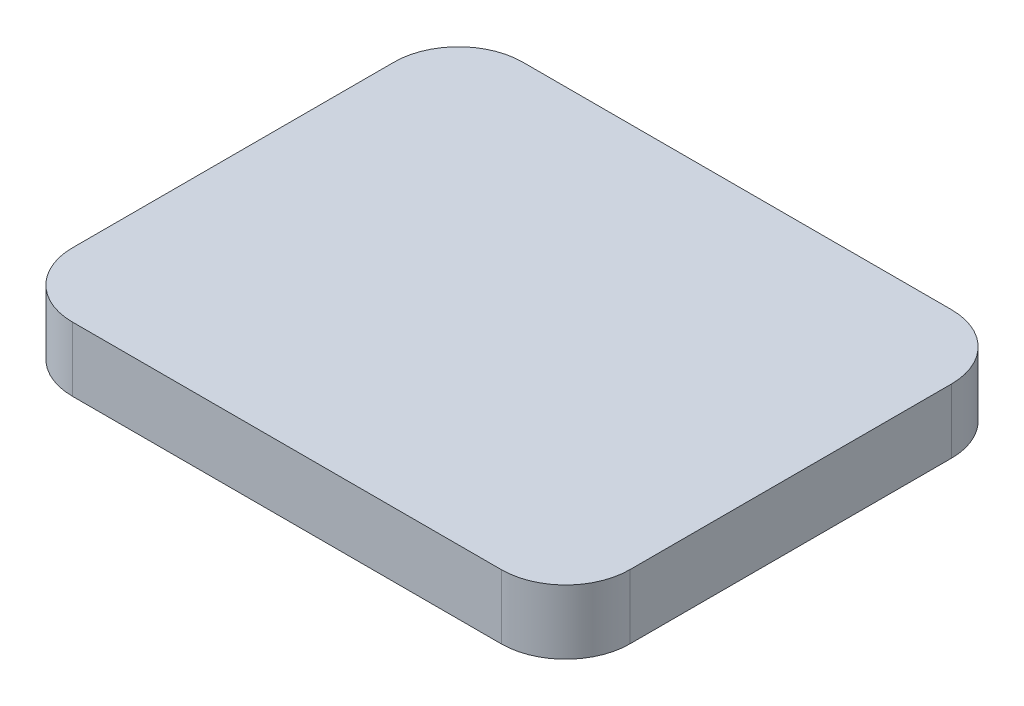
ISO-10303-21;
HEADER;
FILE_DESCRIPTION(('STEP AP214'),'2;1');
FILE_NAME('part.step','',(''),(''),'','','');
FILE_SCHEMA(('AUTOMOTIVE_DESIGN { 1 0 10303 214 1 1 1 1 }'));
ENDSEC;
DATA;
#1=APPLICATION_CONTEXT('core data for automotive mechanical design processes');
#2=APPLICATION_PROTOCOL_DEFINITION('international standard','automotive_design',2000,#1);
#3=PRODUCT_CONTEXT('',#1,'mechanical');
#4=PRODUCT('Part','Part','',(#3));
#5=PRODUCT_RELATED_PRODUCT_CATEGORY('part','',(#4));
#6=PRODUCT_DEFINITION_FORMATION('','',#4);
#7=PRODUCT_DEFINITION_CONTEXT('part definition',#1,'design');
#8=PRODUCT_DEFINITION('design','',#6,#7);
#9=PRODUCT_DEFINITION_SHAPE('','',#8);
#10=(LENGTH_UNIT() NAMED_UNIT(*) SI_UNIT(.MILLI.,.METRE.));
#11=(NAMED_UNIT(*) PLANE_ANGLE_UNIT() SI_UNIT($,.RADIAN.));
#12=(NAMED_UNIT(*) SI_UNIT($,.STERADIAN.) SOLID_ANGLE_UNIT());
#13=UNCERTAINTY_MEASURE_WITH_UNIT(LENGTH_MEASURE(1.E-05),#10,'distance_accuracy_value','');
#14=(GEOMETRIC_REPRESENTATION_CONTEXT(3) GLOBAL_UNCERTAINTY_ASSIGNED_CONTEXT((#13)) GLOBAL_UNIT_ASSIGNED_CONTEXT((#10,
#11,#12)) REPRESENTATION_CONTEXT('',''));
#15=CARTESIAN_POINT('',(0.,0.,0.));
#16=DIRECTION('',(0.,0.,1.));
#17=DIRECTION('',(1.,0.,0.));
#18=AXIS2_PLACEMENT_3D('',#15,#16,#17);
#19=CARTESIAN_POINT('',(100.,30.,-75.));
#20=DIRECTION('',(0.,-1.,0.));
#21=DIRECTION('',(0.,0.,-1.));
#22=AXIS2_PLACEMENT_3D('',#19,#20,#21);
#23=CYLINDRICAL_SURFACE('',#22,30.);
#24=CARTESIAN_POINT('',(100.,0.,-75.));
#25=DIRECTION('',(0.,1.,0.));
#26=DIRECTION('',(0.,0.,-1.));
#27=AXIS2_PLACEMENT_3D('',#24,#25,#26);
#28=CIRCLE('',#27,30.);
#29=CARTESIAN_POINT('',(130.,0.,-75.));
#30=VERTEX_POINT('',#29);
#31=CARTESIAN_POINT('',(100.,0.,-105.));
#32=VERTEX_POINT('',#31);
#33=EDGE_CURVE('E140',#30,#32,#28,.T.);
#34=ORIENTED_EDGE('',*,*,#33,.T.);
#35=DIRECTION('',(0.,-1.,0.));
#36=VECTOR('',#35,1.);
#37=CARTESIAN_POINT('',(100.,30.,-105.));
#38=LINE('',#37,#36);
#39=CARTESIAN_POINT('',(100.,30.,-105.));
#40=VERTEX_POINT('',#39);
#41=EDGE_CURVE('E11',#40,#32,#38,.T.);
#42=ORIENTED_EDGE('',*,*,#41,.F.);
#43=CARTESIAN_POINT('',(100.,30.,-75.));
#44=DIRECTION('',(0.,1.,0.));
#45=DIRECTION('',(0.,0.,-1.));
#46=AXIS2_PLACEMENT_3D('',#43,#44,#45);
#47=CIRCLE('',#46,30.);
#48=CARTESIAN_POINT('',(130.,30.,-75.));
#49=VERTEX_POINT('',#48);
#50=EDGE_CURVE('E162',#49,#40,#47,.T.);
#51=ORIENTED_EDGE('',*,*,#50,.F.);
#52=DIRECTION('',(0.,-1.,0.));
#53=VECTOR('',#52,1.);
#54=CARTESIAN_POINT('',(130.,30.,-75.));
#55=LINE('',#54,#53);
#56=EDGE_CURVE('E136',#49,#30,#55,.T.);
#57=ORIENTED_EDGE('',*,*,#56,.T.);
#58=EDGE_LOOP('',(#34,#42,#51,#57));
#59=FACE_BOUND('',#58,.T.);
#60=ADVANCED_FACE('F39',(#59),#23,.T.);
#61=CARTESIAN_POINT('',(-100.,30.,-105.));
#62=DIRECTION('',(0.,0.,1.));
#63=DIRECTION('',(1.,0.,0.));
#64=AXIS2_PLACEMENT_3D('',#61,#62,#63);
#65=PLANE('',#64);
#66=DIRECTION('',(-1.,0.,0.));
#67=VECTOR('',#66,1.);
#68=CARTESIAN_POINT('',(-100.,0.,-105.));
#69=LINE('',#68,#67);
#70=CARTESIAN_POINT('',(-100.,0.,-105.));
#71=VERTEX_POINT('',#70);
#72=EDGE_CURVE('E144',#32,#71,#69,.T.);
#73=ORIENTED_EDGE('',*,*,#72,.T.);
#74=DIRECTION('',(0.,-1.,0.));
#75=VECTOR('',#74,1.);
#76=CARTESIAN_POINT('',(-100.,30.,-105.));
#77=LINE('',#76,#75);
#78=CARTESIAN_POINT('',(-100.,30.,-105.));
#79=VERTEX_POINT('',#78);
#80=EDGE_CURVE('E48',#79,#71,#77,.T.);
#81=ORIENTED_EDGE('',*,*,#80,.F.);
#82=DIRECTION('',(-1.,0.,0.));
#83=VECTOR('',#82,1.);
#84=CARTESIAN_POINT('',(-100.,30.,-105.));
#85=LINE('',#84,#83);
#86=EDGE_CURVE('E99',#40,#79,#85,.T.);
#87=ORIENTED_EDGE('',*,*,#86,.F.);
#88=ORIENTED_EDGE('',*,*,#41,.T.);
#89=EDGE_LOOP('',(#73,#81,#87,#88));
#90=FACE_BOUND('',#89,.T.);
#91=ADVANCED_FACE('F208',(#90),#65,.F.);
#92=CARTESIAN_POINT('',(-100.,30.,-75.));
#93=DIRECTION('',(0.,-1.,0.));
#94=DIRECTION('',(0.,0.,-1.));
#95=AXIS2_PLACEMENT_3D('',#92,#93,#94);
#96=CYLINDRICAL_SURFACE('',#95,30.);
#97=CARTESIAN_POINT('',(-100.,0.,-75.));
#98=DIRECTION('',(0.,1.,0.));
#99=DIRECTION('',(0.,0.,1.));
#100=AXIS2_PLACEMENT_3D('',#97,#98,#99);
#101=CIRCLE('',#100,30.);
#102=CARTESIAN_POINT('',(-130.,0.,-75.));
#103=VERTEX_POINT('',#102);
#104=EDGE_CURVE('E147',#71,#103,#101,.T.);
#105=ORIENTED_EDGE('',*,*,#104,.T.);
#106=DIRECTION('',(0.,-1.,0.));
#107=VECTOR('',#106,1.);
#108=CARTESIAN_POINT('',(-130.,30.,-75.));
#109=LINE('',#108,#107);
#110=CARTESIAN_POINT('',(-130.,30.,-75.));
#111=VERTEX_POINT('',#110);
#112=EDGE_CURVE('E173',#111,#103,#109,.T.);
#113=ORIENTED_EDGE('',*,*,#112,.F.);
#114=CARTESIAN_POINT('',(-100.,30.,-75.));
#115=DIRECTION('',(0.,1.,0.));
#116=DIRECTION('',(0.,0.,1.));
#117=AXIS2_PLACEMENT_3D('',#114,#115,#116);
#118=CIRCLE('',#117,30.);
#119=EDGE_CURVE('E183',#79,#111,#118,.T.);
#120=ORIENTED_EDGE('',*,*,#119,.F.);
#121=ORIENTED_EDGE('',*,*,#80,.T.);
#122=EDGE_LOOP('',(#105,#113,#120,#121));
#123=FACE_BOUND('',#122,.T.);
#124=ADVANCED_FACE('F181',(#123),#96,.T.);
#125=CARTESIAN_POINT('',(-130.,30.,-75.));
#126=DIRECTION('',(1.,0.,0.));
#127=DIRECTION('',(0.,0.,-1.));
#128=AXIS2_PLACEMENT_3D('',#125,#126,#127);
#129=PLANE('',#128);
#130=DIRECTION('',(0.,0.,1.));
#131=VECTOR('',#130,1.);
#132=CARTESIAN_POINT('',(-130.,0.,-75.));
#133=LINE('',#132,#131);
#134=CARTESIAN_POINT('',(-130.,0.,75.));
#135=VERTEX_POINT('',#134);
#136=EDGE_CURVE('E150',#103,#135,#133,.T.);
#137=ORIENTED_EDGE('',*,*,#136,.T.);
#138=DIRECTION('',(0.,-1.,0.));
#139=VECTOR('',#138,1.);
#140=CARTESIAN_POINT('',(-130.,30.,75.));
#141=LINE('',#140,#139);
#142=CARTESIAN_POINT('',(-130.,30.,75.));
#143=VERTEX_POINT('',#142);
#144=EDGE_CURVE('E169',#143,#135,#141,.T.);
#145=ORIENTED_EDGE('',*,*,#144,.F.);
#146=DIRECTION('',(0.,0.,1.));
#147=VECTOR('',#146,1.);
#148=CARTESIAN_POINT('',(-130.,30.,-75.));
#149=LINE('',#148,#147);
#150=EDGE_CURVE('E196',#111,#143,#149,.T.);
#151=ORIENTED_EDGE('',*,*,#150,.F.);
#152=ORIENTED_EDGE('',*,*,#112,.T.);
#153=EDGE_LOOP('',(#137,#145,#151,#152));
#154=FACE_BOUND('',#153,.T.);
#155=ADVANCED_FACE('F191',(#154),#129,.F.);
#156=CARTESIAN_POINT('',(-100.,30.,75.));
#157=DIRECTION('',(0.,-1.,0.));
#158=DIRECTION('',(0.,0.,-1.));
#159=AXIS2_PLACEMENT_3D('',#156,#157,#158);
#160=CYLINDRICAL_SURFACE('',#159,29.9999999999999);
#161=CARTESIAN_POINT('',(-100.,0.,75.));
#162=DIRECTION('',(0.,1.,0.));
#163=DIRECTION('',(0.,0.,1.));
#164=AXIS2_PLACEMENT_3D('',#161,#162,#163);
#165=CIRCLE('',#164,29.9999999999999);
#166=CARTESIAN_POINT('',(-100.,0.,105.));
#167=VERTEX_POINT('',#166);
#168=EDGE_CURVE('E153',#135,#167,#165,.T.);
#169=ORIENTED_EDGE('',*,*,#168,.T.);
#170=DIRECTION('',(0.,-1.,0.));
#171=VECTOR('',#170,1.);
#172=CARTESIAN_POINT('',(-100.,30.,105.));
#173=LINE('',#172,#171);
#174=CARTESIAN_POINT('',(-100.,30.,105.));
#175=VERTEX_POINT('',#174);
#176=EDGE_CURVE('E129',#175,#167,#173,.T.);
#177=ORIENTED_EDGE('',*,*,#176,.F.);
#178=CARTESIAN_POINT('',(-100.,30.,75.));
#179=DIRECTION('',(0.,1.,0.));
#180=DIRECTION('',(0.,0.,1.));
#181=AXIS2_PLACEMENT_3D('',#178,#179,#180);
#182=CIRCLE('',#181,29.9999999999999);
#183=EDGE_CURVE('E118',#143,#175,#182,.T.);
#184=ORIENTED_EDGE('',*,*,#183,.F.);
#185=ORIENTED_EDGE('',*,*,#144,.T.);
#186=EDGE_LOOP('',(#169,#177,#184,#185));
#187=FACE_BOUND('',#186,.T.);
#188=ADVANCED_FACE('F194',(#187),#160,.T.);
#189=CARTESIAN_POINT('',(-100.,30.,105.));
#190=DIRECTION('',(0.,0.,-1.));
#191=DIRECTION('',(-1.,0.,0.));
#192=AXIS2_PLACEMENT_3D('',#189,#190,#191);
#193=PLANE('',#192);
#194=DIRECTION('',(1.,0.,0.));
#195=VECTOR('',#194,1.);
#196=CARTESIAN_POINT('',(-100.,0.,105.));
#197=LINE('',#196,#195);
#198=CARTESIAN_POINT('',(100.,0.,105.));
#199=VERTEX_POINT('',#198);
#200=EDGE_CURVE('E127',#167,#199,#197,.T.);
#201=ORIENTED_EDGE('',*,*,#200,.T.);
#202=DIRECTION('',(0.,-1.,0.));
#203=VECTOR('',#202,1.);
#204=CARTESIAN_POINT('',(100.,30.,105.));
#205=LINE('',#204,#203);
#206=CARTESIAN_POINT('',(100.,30.,105.));
#207=VERTEX_POINT('',#206);
#208=EDGE_CURVE('E124',#207,#199,#205,.T.);
#209=ORIENTED_EDGE('',*,*,#208,.F.);
#210=DIRECTION('',(1.,0.,0.));
#211=VECTOR('',#210,1.);
#212=CARTESIAN_POINT('',(-100.,30.,105.));
#213=LINE('',#212,#211);
#214=EDGE_CURVE('E112',#175,#207,#213,.T.);
#215=ORIENTED_EDGE('',*,*,#214,.F.);
#216=ORIENTED_EDGE('',*,*,#176,.T.);
#217=EDGE_LOOP('',(#201,#209,#215,#216));
#218=FACE_BOUND('',#217,.T.);
#219=ADVANCED_FACE('F125',(#218),#193,.F.);
#220=CARTESIAN_POINT('',(100.,30.,75.));
#221=DIRECTION('',(0.,-1.,0.));
#222=DIRECTION('',(0.,0.,-1.));
#223=AXIS2_PLACEMENT_3D('',#220,#221,#222);
#224=CYLINDRICAL_SURFACE('',#223,30.);
#225=CARTESIAN_POINT('',(100.,0.,75.));
#226=DIRECTION('',(0.,1.,0.));
#227=DIRECTION('',(0.,0.,1.));
#228=AXIS2_PLACEMENT_3D('',#225,#226,#227);
#229=CIRCLE('',#228,30.);
#230=CARTESIAN_POINT('',(130.,0.,75.));
#231=VERTEX_POINT('',#230);
#232=EDGE_CURVE('E85',#199,#231,#229,.T.);
#233=ORIENTED_EDGE('',*,*,#232,.T.);
#234=DIRECTION('',(0.,-1.,0.));
#235=VECTOR('',#234,1.);
#236=CARTESIAN_POINT('',(130.,30.,75.));
#237=LINE('',#236,#235);
#238=CARTESIAN_POINT('',(130.,30.,75.));
#239=VERTEX_POINT('',#238);
#240=EDGE_CURVE('E130',#239,#231,#237,.T.);
#241=ORIENTED_EDGE('',*,*,#240,.F.);
#242=CARTESIAN_POINT('',(100.,30.,75.));
#243=DIRECTION('',(0.,1.,0.));
#244=DIRECTION('',(0.,0.,1.));
#245=AXIS2_PLACEMENT_3D('',#242,#243,#244);
#246=CIRCLE('',#245,30.);
#247=EDGE_CURVE('E116',#207,#239,#246,.T.);
#248=ORIENTED_EDGE('',*,*,#247,.F.);
#249=ORIENTED_EDGE('',*,*,#208,.T.);
#250=EDGE_LOOP('',(#233,#241,#248,#249));
#251=FACE_BOUND('',#250,.T.);
#252=ADVANCED_FACE('F132',(#251),#224,.T.);
#253=CARTESIAN_POINT('',(130.,30.,-75.));
#254=DIRECTION('',(-1.,0.,0.));
#255=DIRECTION('',(0.,0.,1.));
#256=AXIS2_PLACEMENT_3D('',#253,#254,#255);
#257=PLANE('',#256);
#258=DIRECTION('',(0.,0.,-1.));
#259=VECTOR('',#258,1.);
#260=CARTESIAN_POINT('',(130.,0.,-75.));
#261=LINE('',#260,#259);
#262=EDGE_CURVE('E91',#231,#30,#261,.T.);
#263=ORIENTED_EDGE('',*,*,#262,.T.);
#264=ORIENTED_EDGE('',*,*,#56,.F.);
#265=DIRECTION('',(0.,0.,-1.));
#266=VECTOR('',#265,1.);
#267=CARTESIAN_POINT('',(130.,30.,-75.));
#268=LINE('',#267,#266);
#269=EDGE_CURVE('E56',#239,#49,#268,.T.);
#270=ORIENTED_EDGE('',*,*,#269,.F.);
#271=ORIENTED_EDGE('',*,*,#240,.T.);
#272=EDGE_LOOP('',(#263,#264,#270,#271));
#273=FACE_BOUND('',#272,.T.);
#274=ADVANCED_FACE('F224',(#273),#257,.F.);
#275=CARTESIAN_POINT('',(100.,30.,-75.));
#276=DIRECTION('',(0.,-1.,0.));
#277=DIRECTION('',(0.,0.,-1.));
#278=AXIS2_PLACEMENT_3D('',#275,#276,#277);
#279=PLANE('',#278);
#280=ORIENTED_EDGE('',*,*,#50,.T.);
#281=ORIENTED_EDGE('',*,*,#86,.T.);
#282=ORIENTED_EDGE('',*,*,#119,.T.);
#283=ORIENTED_EDGE('',*,*,#150,.T.);
#284=ORIENTED_EDGE('',*,*,#183,.T.);
#285=ORIENTED_EDGE('',*,*,#214,.T.);
#286=ORIENTED_EDGE('',*,*,#247,.T.);
#287=ORIENTED_EDGE('',*,*,#269,.T.);
#288=EDGE_LOOP('',(#280,#281,#282,#283,#284,#285,#286,#287));
#289=FACE_BOUND('',#288,.T.);
#290=ADVANCED_FACE('F114',(#289),#279,.F.);
#291=CARTESIAN_POINT('',(100.,0.,-75.));
#292=DIRECTION('',(0.,-1.,0.));
#293=DIRECTION('',(0.,0.,-1.));
#294=AXIS2_PLACEMENT_3D('',#291,#292,#293);
#295=PLANE('',#294);
#296=ORIENTED_EDGE('',*,*,#33,.F.);
#297=ORIENTED_EDGE('',*,*,#262,.F.);
#298=ORIENTED_EDGE('',*,*,#232,.F.);
#299=ORIENTED_EDGE('',*,*,#200,.F.);
#300=ORIENTED_EDGE('',*,*,#168,.F.);
#301=ORIENTED_EDGE('',*,*,#136,.F.);
#302=ORIENTED_EDGE('',*,*,#104,.F.);
#303=ORIENTED_EDGE('',*,*,#72,.F.);
#304=EDGE_LOOP('',(#296,#297,#298,#299,#300,#301,#302,#303));
#305=FACE_BOUND('',#304,.T.);
#306=ADVANCED_FACE('F187',(#305),#295,.T.);
#307=CLOSED_SHELL('',(#60,#91,#124,#155,#188,#219,#252,#274,#290,#306));
#308=MANIFOLD_SOLID_BREP('B2',#307);
#309=ADVANCED_BREP_SHAPE_REPRESENTATION('',(#18,#308),#14);
#310=SHAPE_DEFINITION_REPRESENTATION(#9,#309);
ENDSEC;
END-ISO-10303-21;
